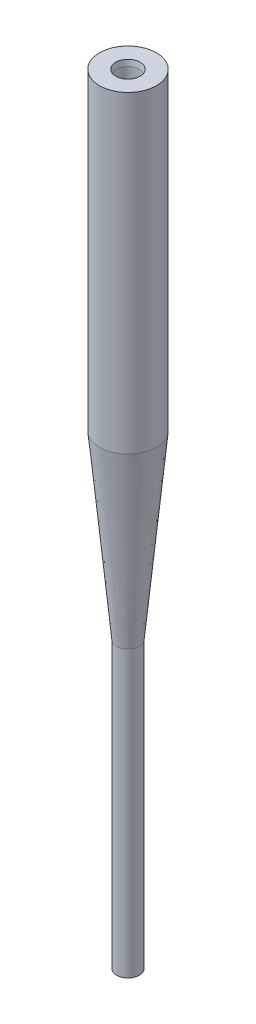
ISO-10303-21;
HEADER;
FILE_DESCRIPTION(('STEP AP214'),'2;1');
FILE_NAME('part.step','',(''),(''),'','','');
FILE_SCHEMA(('AUTOMOTIVE_DESIGN { 1 0 10303 214 1 1 1 1 }'));
ENDSEC;
DATA;
#1=APPLICATION_CONTEXT('core data for automotive mechanical design processes');
#2=APPLICATION_PROTOCOL_DEFINITION('international standard','automotive_design',2000,#1);
#3=PRODUCT_CONTEXT('',#1,'mechanical');
#4=PRODUCT('Part','Part','',(#3));
#5=PRODUCT_RELATED_PRODUCT_CATEGORY('part','',(#4));
#6=PRODUCT_DEFINITION_FORMATION('','',#4);
#7=PRODUCT_DEFINITION_CONTEXT('part definition',#1,'design');
#8=PRODUCT_DEFINITION('design','',#6,#7);
#9=PRODUCT_DEFINITION_SHAPE('','',#8);
#10=(LENGTH_UNIT() NAMED_UNIT(*) SI_UNIT(.MILLI.,.METRE.));
#11=(NAMED_UNIT(*) PLANE_ANGLE_UNIT() SI_UNIT($,.RADIAN.));
#12=(NAMED_UNIT(*) SI_UNIT($,.STERADIAN.) SOLID_ANGLE_UNIT());
#13=UNCERTAINTY_MEASURE_WITH_UNIT(LENGTH_MEASURE(1.E-05),#10,'distance_accuracy_value','');
#14=(GEOMETRIC_REPRESENTATION_CONTEXT(3) GLOBAL_UNCERTAINTY_ASSIGNED_CONTEXT((#13)) GLOBAL_UNIT_ASSIGNED_CONTEXT((#10,
#11,#12)) REPRESENTATION_CONTEXT('',''));
#15=CARTESIAN_POINT('',(0.,0.,0.));
#16=DIRECTION('',(0.,0.,1.));
#17=DIRECTION('',(1.,0.,0.));
#18=AXIS2_PLACEMENT_3D('',#15,#16,#17);
#19=CARTESIAN_POINT('',(5.,-52.07,0.));
#20=DIRECTION('',(0.,-1.,0.));
#21=DIRECTION('',(1.,0.,0.));
#22=AXIS2_PLACEMENT_3D('',#19,#20,#21);
#23=PLANE('',#22);
#24=CARTESIAN_POINT('',(0.,-52.07,0.));
#25=DIRECTION('',(0.,-1.,0.));
#26=DIRECTION('',(1.,0.,0.));
#27=AXIS2_PLACEMENT_3D('',#24,#25,#26);
#28=CIRCLE('',#27,2.14054083470227);
#29=CARTESIAN_POINT('',(2.14054083470227,-52.07,0.));
#30=VERTEX_POINT('',#29);
#31=EDGE_CURVE('E10',#30,#30,#28,.T.);
#32=ORIENTED_EDGE('',*,*,#31,.T.);
#33=EDGE_LOOP('',(#32));
#34=FACE_BOUND('',#33,.T.);
#35=CARTESIAN_POINT('',(0.,-52.07,0.));
#36=DIRECTION('',(0.,1.,0.));
#37=DIRECTION('',(-1.,0.,0.));
#38=AXIS2_PLACEMENT_3D('',#35,#36,#37);
#39=CIRCLE('',#38,5.);
#40=CARTESIAN_POINT('',(-5.,-52.07,0.));
#41=VERTEX_POINT('',#40);
#42=EDGE_CURVE('E55',#41,#41,#39,.T.);
#43=ORIENTED_EDGE('',*,*,#42,.T.);
#44=EDGE_LOOP('',(#43));
#45=FACE_BOUND('',#44,.T.);
#46=ADVANCED_FACE('F32',(#34,#45),#23,.F.);
#47=CARTESIAN_POINT('',(0.,-188.87,0.));
#48=DIRECTION('',(0.,1.,0.));
#49=DIRECTION('',(-1.,0.,0.));
#50=AXIS2_PLACEMENT_3D('',#47,#48,#49);
#51=PLANE('',#50);
#52=CARTESIAN_POINT('',(0.,-188.87,0.));
#53=DIRECTION('',(0.,1.,0.));
#54=DIRECTION('',(-1.,0.,0.));
#55=AXIS2_PLACEMENT_3D('',#52,#53,#54);
#56=CIRCLE('',#55,2.);
#57=CARTESIAN_POINT('',(-1.99999999999998,-188.87,0.));
#58=VERTEX_POINT('',#57);
#59=EDGE_CURVE('E43',#58,#58,#56,.T.);
#60=ORIENTED_EDGE('',*,*,#59,.F.);
#61=EDGE_LOOP('',(#60));
#62=FACE_BOUND('',#61,.T.);
#63=ADVANCED_FACE('F77',(#62),#51,.F.);
#64=CARTESIAN_POINT('',(0.,-52.07,0.));
#65=DIRECTION('',(0.,1.,0.));
#66=DIRECTION('',(-1.,0.,0.));
#67=AXIS2_PLACEMENT_3D('',#64,#65,#66);
#68=CYLINDRICAL_SURFACE('',#67,2.);
#69=CARTESIAN_POINT('',(0.,-138.87,0.));
#70=DIRECTION('',(0.,1.,0.));
#71=DIRECTION('',(-1.,0.,0.));
#72=AXIS2_PLACEMENT_3D('',#69,#70,#71);
#73=CIRCLE('',#72,2.00000000000001);
#74=CARTESIAN_POINT('',(-2.,-138.87,0.));
#75=VERTEX_POINT('',#74);
#76=EDGE_CURVE('E47',#75,#75,#73,.T.);
#77=ORIENTED_EDGE('',*,*,#76,.F.);
#78=EDGE_LOOP('',(#77));
#79=FACE_BOUND('',#78,.T.);
#80=ORIENTED_EDGE('',*,*,#59,.T.);
#81=EDGE_LOOP('',(#80));
#82=FACE_BOUND('',#81,.T.);
#83=ADVANCED_FACE('F81',(#79,#82),#68,.T.);
#84=CARTESIAN_POINT('',(0.,-138.87,0.));
#85=DIRECTION('',(0.,1.,0.));
#86=DIRECTION('',(-1.,0.,0.));
#87=AXIS2_PLACEMENT_3D('',#84,#85,#86);
#88=CONICAL_SURFACE('',#87,2.00000000000001,0.0940612346279859);
#89=CARTESIAN_POINT('',(0.,-107.07,0.));
#90=DIRECTION('',(0.,1.,0.));
#91=DIRECTION('',(-1.,0.,0.));
#92=AXIS2_PLACEMENT_3D('',#89,#90,#91);
#93=CIRCLE('',#92,4.99999999999999);
#94=CARTESIAN_POINT('',(-4.99999999999999,-107.07,0.));
#95=VERTEX_POINT('',#94);
#96=EDGE_CURVE('E52',#95,#95,#93,.T.);
#97=ORIENTED_EDGE('',*,*,#96,.F.);
#98=EDGE_LOOP('',(#97));
#99=FACE_BOUND('',#98,.T.);
#100=ORIENTED_EDGE('',*,*,#76,.T.);
#101=EDGE_LOOP('',(#100));
#102=FACE_BOUND('',#101,.T.);
#103=ADVANCED_FACE('F73',(#99,#102),#88,.T.);
#104=CARTESIAN_POINT('',(0.,-52.07,0.));
#105=DIRECTION('',(0.,1.,0.));
#106=DIRECTION('',(-1.,0.,0.));
#107=AXIS2_PLACEMENT_3D('',#104,#105,#106);
#108=CYLINDRICAL_SURFACE('',#107,5.);
#109=ORIENTED_EDGE('',*,*,#42,.F.);
#110=EDGE_LOOP('',(#109));
#111=FACE_BOUND('',#110,.T.);
#112=ORIENTED_EDGE('',*,*,#96,.T.);
#113=EDGE_LOOP('',(#112));
#114=FACE_BOUND('',#113,.T.);
#115=ADVANCED_FACE('F66',(#111,#114),#108,.T.);
#116=CARTESIAN_POINT('',(0.,-58.07,0.));
#117=DIRECTION('',(0.,1.,0.));
#118=DIRECTION('',(-1.,0.,0.));
#119=AXIS2_PLACEMENT_3D('',#116,#117,#118);
#120=CYLINDRICAL_SURFACE('',#119,2.);
#121=CARTESIAN_POINT('',(0.,-53.0699999999991,0.));
#122=DIRECTION('',(0.,-1.,0.));
#123=DIRECTION('',(1.,0.,0.));
#124=AXIS2_PLACEMENT_3D('',#121,#122,#123);
#125=CIRCLE('',#124,2.);
#126=CARTESIAN_POINT('',(2.00000000000001,-53.0699999999991,0.));
#127=VERTEX_POINT('',#126);
#128=EDGE_CURVE('E39',#127,#127,#125,.F.);
#129=ORIENTED_EDGE('',*,*,#128,.T.);
#130=EDGE_LOOP('',(#129));
#131=FACE_BOUND('',#130,.T.);
#132=CARTESIAN_POINT('',(0.,-58.07,0.));
#133=DIRECTION('',(0.,1.,0.));
#134=DIRECTION('',(-1.,0.,0.));
#135=AXIS2_PLACEMENT_3D('',#132,#133,#134);
#136=CIRCLE('',#135,2.);
#137=CARTESIAN_POINT('',(-1.99999999999999,-58.07,0.));
#138=VERTEX_POINT('',#137);
#139=EDGE_CURVE('E58',#138,#138,#136,.T.);
#140=ORIENTED_EDGE('',*,*,#139,.F.);
#141=EDGE_LOOP('',(#140));
#142=FACE_BOUND('',#141,.T.);
#143=ADVANCED_FACE('F64',(#131,#142),#120,.F.);
#144=CARTESIAN_POINT('',(0.,-58.07,0.));
#145=DIRECTION('',(0.,1.,0.));
#146=DIRECTION('',(-1.,0.,0.));
#147=AXIS2_PLACEMENT_3D('',#144,#145,#146);
#148=PLANE('',#147);
#149=ORIENTED_EDGE('',*,*,#139,.T.);
#150=EDGE_LOOP('',(#149));
#151=FACE_BOUND('',#150,.T.);
#152=ADVANCED_FACE('F62',(#151),#148,.T.);
#153=CARTESIAN_POINT('',(0.,-53.0699999999991,0.));
#154=DIRECTION('',(0.,1.,0.));
#155=DIRECTION('',(-1.,0.,0.));
#156=AXIS2_PLACEMENT_3D('',#153,#154,#155);
#157=CONICAL_SURFACE('',#156,2.,0.139626340159541);
#158=ORIENTED_EDGE('',*,*,#31,.F.);
#159=EDGE_LOOP('',(#158));
#160=FACE_BOUND('',#159,.T.);
#161=ORIENTED_EDGE('',*,*,#128,.F.);
#162=EDGE_LOOP('',(#161));
#163=FACE_BOUND('',#162,.T.);
#164=ADVANCED_FACE('F34',(#160,#163),#157,.F.);
#165=CLOSED_SHELL('',(#46,#63,#83,#103,#115,#143,#152,#164));
#166=MANIFOLD_SOLID_BREP('B2',#165);
#167=ADVANCED_BREP_SHAPE_REPRESENTATION('',(#18,#166),#14);
#168=SHAPE_DEFINITION_REPRESENTATION(#9,#167);
ENDSEC;
END-ISO-10303-21;
